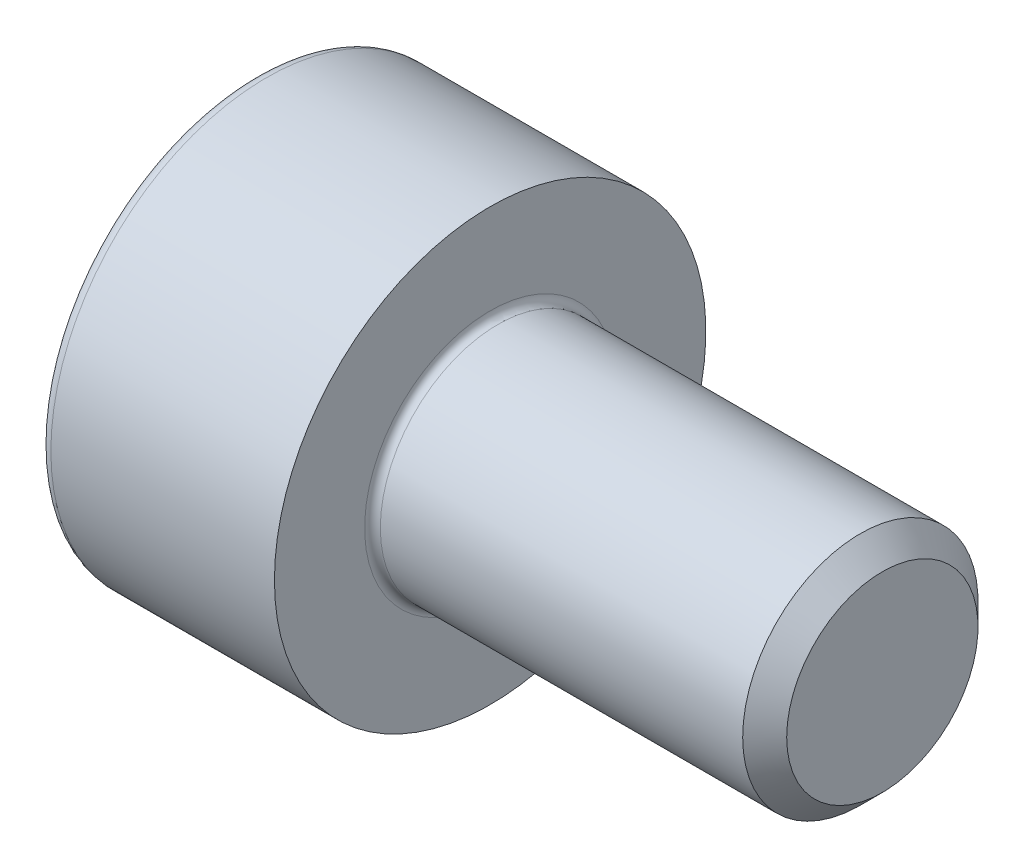
ISO-10303-21;
HEADER;
FILE_DESCRIPTION(('STEP AP214'),'2;1');
FILE_NAME('part.step','',(''),(''),'','','');
FILE_SCHEMA(('AUTOMOTIVE_DESIGN { 1 0 10303 214 1 1 1 1 }'));
ENDSEC;
DATA;
#1=APPLICATION_CONTEXT('core data for automotive mechanical design processes');
#2=APPLICATION_PROTOCOL_DEFINITION('international standard','automotive_design',2000,#1);
#3=PRODUCT_CONTEXT('',#1,'mechanical');
#4=PRODUCT('Part','Part','',(#3));
#5=PRODUCT_RELATED_PRODUCT_CATEGORY('part','',(#4));
#6=PRODUCT_DEFINITION_FORMATION('','',#4);
#7=PRODUCT_DEFINITION_CONTEXT('part definition',#1,'design');
#8=PRODUCT_DEFINITION('design','',#6,#7);
#9=PRODUCT_DEFINITION_SHAPE('','',#8);
#10=(LENGTH_UNIT() NAMED_UNIT(*) SI_UNIT(.MILLI.,.METRE.));
#11=(NAMED_UNIT(*) PLANE_ANGLE_UNIT() SI_UNIT($,.RADIAN.));
#12=(NAMED_UNIT(*) SI_UNIT($,.STERADIAN.) SOLID_ANGLE_UNIT());
#13=UNCERTAINTY_MEASURE_WITH_UNIT(LENGTH_MEASURE(1.E-05),#10,'distance_accuracy_value','');
#14=(GEOMETRIC_REPRESENTATION_CONTEXT(3) GLOBAL_UNCERTAINTY_ASSIGNED_CONTEXT((#13)) GLOBAL_UNIT_ASSIGNED_CONTEXT((#10,
#11,#12)) REPRESENTATION_CONTEXT('',''));
#15=CARTESIAN_POINT('',(0.,0.,0.));
#16=DIRECTION('',(0.,0.,1.));
#17=DIRECTION('',(1.,0.,0.));
#18=AXIS2_PLACEMENT_3D('',#15,#16,#17);
#19=CARTESIAN_POINT('',(0.,0.,0.));
#20=DIRECTION('',(-1.,0.,0.));
#21=DIRECTION('',(0.,0.,1.));
#22=AXIS2_PLACEMENT_3D('',#19,#20,#21);
#23=PLANE('',#22);
#24=DIRECTION('',(0.,-0.499999999999999,0.866025403784439));
#25=VECTOR('',#24,1.);
#26=CARTESIAN_POINT('',(0.,1.47801668912544,0.));
#27=LINE('',#26,#25);
#28=CARTESIAN_POINT('',(0.,1.47801668912544,0.));
#29=VERTEX_POINT('',#28);
#30=CARTESIAN_POINT('',(0.,0.739008344562723,1.28));
#31=VERTEX_POINT('',#30);
#32=EDGE_CURVE('E265',#29,#31,#27,.T.);
#33=ORIENTED_EDGE('',*,*,#32,.T.);
#34=DIRECTION('',(0.,1.,0.));
#35=VECTOR('',#34,1.);
#36=CARTESIAN_POINT('',(0.,-0.73900834456272,1.28));
#37=LINE('',#36,#35);
#38=CARTESIAN_POINT('',(0.,-0.73900834456272,1.28));
#39=VERTEX_POINT('',#38);
#40=EDGE_CURVE('E137',#39,#31,#37,.T.);
#41=ORIENTED_EDGE('',*,*,#40,.F.);
#42=DIRECTION('',(0.,-0.500000000000001,-0.866025403784438));
#43=VECTOR('',#42,1.);
#44=CARTESIAN_POINT('',(0.,-0.73900834456272,1.28));
#45=LINE('',#44,#43);
#46=CARTESIAN_POINT('',(0.,-1.47801668912544,0.));
#47=VERTEX_POINT('',#46);
#48=EDGE_CURVE('E268',#39,#47,#45,.T.);
#49=ORIENTED_EDGE('',*,*,#48,.T.);
#50=DIRECTION('',(0.,0.499999999999999,-0.866025403784439));
#51=VECTOR('',#50,1.);
#52=CARTESIAN_POINT('',(0.,-1.47801668912544,0.));
#53=LINE('',#52,#51);
#54=CARTESIAN_POINT('',(0.,-0.739008344562723,-1.28));
#55=VERTEX_POINT('',#54);
#56=EDGE_CURVE('E271',#47,#55,#53,.T.);
#57=ORIENTED_EDGE('',*,*,#56,.T.);
#58=DIRECTION('',(0.,-1.,0.));
#59=VECTOR('',#58,1.);
#60=CARTESIAN_POINT('',(0.,0.73900834456272,-1.28));
#61=LINE('',#60,#59);
#62=CARTESIAN_POINT('',(0.,0.73900834456272,-1.28));
#63=VERTEX_POINT('',#62);
#64=EDGE_CURVE('E274',#63,#55,#61,.T.);
#65=ORIENTED_EDGE('',*,*,#64,.F.);
#66=DIRECTION('',(0.,-0.500000000000001,-0.866025403784438));
#67=VECTOR('',#66,1.);
#68=CARTESIAN_POINT('',(0.,1.47801668912544,0.));
#69=LINE('',#68,#67);
#70=EDGE_CURVE('E132',#29,#63,#69,.T.);
#71=ORIENTED_EDGE('',*,*,#70,.F.);
#72=EDGE_LOOP('',(#33,#41,#49,#57,#65,#71));
#73=FACE_BOUND('',#72,.T.);
#74=CARTESIAN_POINT('',(0.,0.,0.));
#75=DIRECTION('',(-1.,0.,0.));
#76=DIRECTION('',(0.,0.,1.));
#77=AXIS2_PLACEMENT_3D('',#74,#75,#76);
#78=CIRCLE('',#77,2.6);
#79=CARTESIAN_POINT('',(0.,0.,2.6));
#80=VERTEX_POINT('',#79);
#81=EDGE_CURVE('E49',#80,#80,#78,.T.);
#82=ORIENTED_EDGE('',*,*,#81,.T.);
#83=EDGE_LOOP('',(#82));
#84=FACE_BOUND('',#83,.T.);
#85=ADVANCED_FACE('F41',(#73,#84),#23,.T.);
#86=CARTESIAN_POINT('',(-31.75,0.,0.));
#87=DIRECTION('',(-1.,0.,0.));
#88=DIRECTION('',(0.,0.,1.));
#89=AXIS2_PLACEMENT_3D('',#86,#87,#88);
#90=CYLINDRICAL_SURFACE('',#89,2.75);
#91=CARTESIAN_POINT('',(0.149999999999997,0.,0.));
#92=DIRECTION('',(-1.,0.,0.));
#93=DIRECTION('',(0.,0.,1.));
#94=AXIS2_PLACEMENT_3D('',#91,#92,#93);
#95=CIRCLE('',#94,2.75);
#96=CARTESIAN_POINT('',(0.149999999999997,0.,2.75));
#97=VERTEX_POINT('',#96);
#98=EDGE_CURVE('E11',#97,#97,#95,.F.);
#99=ORIENTED_EDGE('',*,*,#98,.T.);
#100=EDGE_LOOP('',(#99));
#101=FACE_BOUND('',#100,.T.);
#102=CARTESIAN_POINT('',(3.,0.,0.));
#103=DIRECTION('',(-1.,0.,0.));
#104=DIRECTION('',(0.,0.,1.));
#105=AXIS2_PLACEMENT_3D('',#102,#103,#104);
#106=CIRCLE('',#105,2.75);
#107=CARTESIAN_POINT('',(3.,0.,2.75));
#108=VERTEX_POINT('',#107);
#109=EDGE_CURVE('E155',#108,#108,#106,.T.);
#110=ORIENTED_EDGE('',*,*,#109,.T.);
#111=EDGE_LOOP('',(#110));
#112=FACE_BOUND('',#111,.T.);
#113=ADVANCED_FACE('F180',(#101,#112),#90,.T.);
#114=CARTESIAN_POINT('',(3.,2.75,0.));
#115=DIRECTION('',(1.,0.,0.));
#116=DIRECTION('',(0.,0.,-1.));
#117=AXIS2_PLACEMENT_3D('',#114,#115,#116);
#118=PLANE('',#117);
#119=CARTESIAN_POINT('',(3.,0.,0.));
#120=DIRECTION('',(1.,0.,0.));
#121=DIRECTION('',(0.,0.,-1.));
#122=AXIS2_PLACEMENT_3D('',#119,#120,#121);
#123=CIRCLE('',#122,1.6);
#124=CARTESIAN_POINT('',(3.,0.,-1.6));
#125=VERTEX_POINT('',#124);
#126=EDGE_CURVE('E158',#125,#125,#123,.F.);
#127=ORIENTED_EDGE('',*,*,#126,.T.);
#128=EDGE_LOOP('',(#127));
#129=FACE_BOUND('',#128,.T.);
#130=ORIENTED_EDGE('',*,*,#109,.F.);
#131=EDGE_LOOP('',(#130));
#132=FACE_BOUND('',#131,.T.);
#133=ADVANCED_FACE('F185',(#129,#132),#118,.T.);
#134=CARTESIAN_POINT('',(-31.75,0.,0.));
#135=DIRECTION('',(-1.,0.,0.));
#136=DIRECTION('',(0.,0.,1.));
#137=AXIS2_PLACEMENT_3D('',#134,#135,#136);
#138=CYLINDRICAL_SURFACE('',#137,1.5);
#139=CARTESIAN_POINT('',(3.1,0.,0.));
#140=DIRECTION('',(1.,0.,0.));
#141=DIRECTION('',(0.,0.,-1.));
#142=AXIS2_PLACEMENT_3D('',#139,#140,#141);
#143=CIRCLE('',#142,1.5);
#144=CARTESIAN_POINT('',(3.1,0.,-1.5));
#145=VERTEX_POINT('',#144);
#146=EDGE_CURVE('E161',#145,#145,#143,.T.);
#147=ORIENTED_EDGE('',*,*,#146,.T.);
#148=EDGE_LOOP('',(#147));
#149=FACE_BOUND('',#148,.T.);
#150=CARTESIAN_POINT('',(7.71950000000001,0.,0.));
#151=DIRECTION('',(-1.,0.,0.));
#152=DIRECTION('',(0.,0.,1.));
#153=AXIS2_PLACEMENT_3D('',#150,#151,#152);
#154=CIRCLE('',#153,1.5);
#155=CARTESIAN_POINT('',(7.71950000000001,0.,1.5));
#156=VERTEX_POINT('',#155);
#157=EDGE_CURVE('E152',#156,#156,#154,.T.);
#158=ORIENTED_EDGE('',*,*,#157,.T.);
#159=EDGE_LOOP('',(#158));
#160=FACE_BOUND('',#159,.T.);
#161=ADVANCED_FACE('F191',(#149,#160),#138,.T.);
#162=CARTESIAN_POINT('',(8.,0.,0.));
#163=DIRECTION('',(-1.,0.,0.));
#164=DIRECTION('',(0.,0.,1.));
#165=AXIS2_PLACEMENT_3D('',#162,#163,#164);
#166=CONICAL_SURFACE('',#165,1.2195,0.785398163397469);
#167=ORIENTED_EDGE('',*,*,#157,.F.);
#168=EDGE_LOOP('',(#167));
#169=FACE_BOUND('',#168,.T.);
#170=CARTESIAN_POINT('',(8.,0.,0.));
#171=DIRECTION('',(-1.,0.,0.));
#172=DIRECTION('',(0.,0.,1.));
#173=AXIS2_PLACEMENT_3D('',#170,#171,#172);
#174=CIRCLE('',#173,1.2195);
#175=CARTESIAN_POINT('',(8.,0.,1.2195));
#176=VERTEX_POINT('',#175);
#177=EDGE_CURVE('E148',#176,#176,#174,.T.);
#178=ORIENTED_EDGE('',*,*,#177,.T.);
#179=EDGE_LOOP('',(#178));
#180=FACE_BOUND('',#179,.T.);
#181=ADVANCED_FACE('F195',(#169,#180),#166,.T.);
#182=CARTESIAN_POINT('',(8.,1.2195,0.));
#183=DIRECTION('',(1.,0.,0.));
#184=DIRECTION('',(0.,0.,-1.));
#185=AXIS2_PLACEMENT_3D('',#182,#183,#184);
#186=PLANE('',#185);
#187=ORIENTED_EDGE('',*,*,#177,.F.);
#188=EDGE_LOOP('',(#187));
#189=FACE_BOUND('',#188,.T.);
#190=ADVANCED_FACE('F177',(#189),#186,.T.);
#191=CARTESIAN_POINT('',(3.1,0.,0.));
#192=DIRECTION('',(1.,0.,0.));
#193=DIRECTION('',(0.,0.,-1.));
#194=AXIS2_PLACEMENT_3D('',#191,#192,#193);
#195=TOROIDAL_SURFACE('',#194,1.6,0.1);
#196=ORIENTED_EDGE('',*,*,#146,.F.);
#197=EDGE_LOOP('',(#196));
#198=FACE_BOUND('',#197,.T.);
#199=ORIENTED_EDGE('',*,*,#126,.F.);
#200=EDGE_LOOP('',(#199));
#201=FACE_BOUND('',#200,.T.);
#202=ADVANCED_FACE('F168',(#198,#201),#195,.F.);
#203=CARTESIAN_POINT('',(0.149999999999997,0.,0.));
#204=DIRECTION('',(-1.,0.,0.));
#205=DIRECTION('',(0.,0.,1.));
#206=AXIS2_PLACEMENT_3D('',#203,#204,#205);
#207=TOROIDAL_SURFACE('',#206,2.6,0.15);
#208=ORIENTED_EDGE('',*,*,#98,.F.);
#209=EDGE_LOOP('',(#208));
#210=FACE_BOUND('',#209,.T.);
#211=ORIENTED_EDGE('',*,*,#81,.F.);
#212=EDGE_LOOP('',(#211));
#213=FACE_BOUND('',#212,.T.);
#214=ADVANCED_FACE('F43',(#210,#213),#207,.T.);
#215=CARTESIAN_POINT('',(1.3,1.47801668912544,0.));
#216=DIRECTION('',(0.,-0.866025403784439,-0.499999999999999));
#217=DIRECTION('',(0.,0.499999999999999,-0.866025403784439));
#218=AXIS2_PLACEMENT_3D('',#215,#216,#217);
#219=PLANE('',#218);
#220=ORIENTED_EDGE('',*,*,#32,.F.);
#221=DIRECTION('',(-1.,0.,0.));
#222=VECTOR('',#221,1.);
#223=CARTESIAN_POINT('',(1.3,1.47801668912544,0.));
#224=LINE('',#223,#222);
#225=CARTESIAN_POINT('',(1.3,1.47801668912544,0.));
#226=VERTEX_POINT('',#225);
#227=EDGE_CURVE('E255',#226,#29,#224,.T.);
#228=ORIENTED_EDGE('',*,*,#227,.F.);
#229=DIRECTION('',(0.,-0.499999999999999,0.866025403784439));
#230=VECTOR('',#229,1.);
#231=CARTESIAN_POINT('',(1.3,1.47801668912544,0.));
#232=LINE('',#231,#230);
#233=CARTESIAN_POINT('',(1.3,1.10851251684408,0.64));
#234=VERTEX_POINT('',#233);
#235=EDGE_CURVE('E124',#226,#234,#232,.T.);
#236=ORIENTED_EDGE('',*,*,#235,.T.);
#237=CARTESIAN_POINT('',(1.3,0.739008344562723,1.28));
#238=VERTEX_POINT('',#237);
#239=EDGE_CURVE('E115',#234,#238,#232,.T.);
#240=ORIENTED_EDGE('',*,*,#239,.T.);
#241=DIRECTION('',(-1.,0.,0.));
#242=VECTOR('',#241,1.);
#243=CARTESIAN_POINT('',(1.3,0.739008344562723,1.28));
#244=LINE('',#243,#242);
#245=EDGE_CURVE('E129',#238,#31,#244,.T.);
#246=ORIENTED_EDGE('',*,*,#245,.T.);
#247=EDGE_LOOP('',(#220,#228,#236,#240,#246));
#248=FACE_BOUND('',#247,.T.);
#249=ADVANCED_FACE('F128',(#248),#219,.T.);
#250=CARTESIAN_POINT('',(1.3,-0.73900834456272,1.28));
#251=DIRECTION('',(0.,0.,1.));
#252=DIRECTION('',(0.,-1.,0.));
#253=AXIS2_PLACEMENT_3D('',#250,#251,#252);
#254=PLANE('',#253);
#255=ORIENTED_EDGE('',*,*,#40,.T.);
#256=ORIENTED_EDGE('',*,*,#245,.F.);
#257=DIRECTION('',(0.,1.,0.));
#258=VECTOR('',#257,1.);
#259=CARTESIAN_POINT('',(1.3,-0.73900834456272,1.28));
#260=LINE('',#259,#258);
#261=CARTESIAN_POINT('',(1.3,0.,1.28));
#262=VERTEX_POINT('',#261);
#263=EDGE_CURVE('E112',#262,#238,#260,.T.);
#264=ORIENTED_EDGE('',*,*,#263,.F.);
#265=CARTESIAN_POINT('',(1.3,-0.73900834456272,1.28));
#266=VERTEX_POINT('',#265);
#267=EDGE_CURVE('E123',#266,#262,#260,.T.);
#268=ORIENTED_EDGE('',*,*,#267,.F.);
#269=DIRECTION('',(-1.,0.,0.));
#270=VECTOR('',#269,1.);
#271=CARTESIAN_POINT('',(1.3,-0.73900834456272,1.28));
#272=LINE('',#271,#270);
#273=EDGE_CURVE('E139',#266,#39,#272,.T.);
#274=ORIENTED_EDGE('',*,*,#273,.T.);
#275=EDGE_LOOP('',(#255,#256,#264,#268,#274));
#276=FACE_BOUND('',#275,.T.);
#277=ADVANCED_FACE('F134',(#276),#254,.F.);
#278=CARTESIAN_POINT('',(1.3,-0.73900834456272,1.28));
#279=DIRECTION('',(0.,0.866025403784438,-0.500000000000001));
#280=DIRECTION('',(0.,0.500000000000001,0.866025403784438));
#281=AXIS2_PLACEMENT_3D('',#278,#279,#280);
#282=PLANE('',#281);
#283=ORIENTED_EDGE('',*,*,#48,.F.);
#284=ORIENTED_EDGE('',*,*,#273,.F.);
#285=DIRECTION('',(0.,-0.500000000000001,-0.866025403784438));
#286=VECTOR('',#285,1.);
#287=CARTESIAN_POINT('',(1.3,-0.73900834456272,1.28));
#288=LINE('',#287,#286);
#289=CARTESIAN_POINT('',(1.3,-1.10851251684408,0.640000000000002));
#290=VERTEX_POINT('',#289);
#291=EDGE_CURVE('E294',#266,#290,#288,.T.);
#292=ORIENTED_EDGE('',*,*,#291,.T.);
#293=CARTESIAN_POINT('',(1.3,-1.47801668912544,0.));
#294=VERTEX_POINT('',#293);
#295=EDGE_CURVE('E283',#290,#294,#288,.T.);
#296=ORIENTED_EDGE('',*,*,#295,.T.);
#297=DIRECTION('',(-1.,0.,0.));
#298=VECTOR('',#297,1.);
#299=CARTESIAN_POINT('',(1.3,-1.47801668912544,0.));
#300=LINE('',#299,#298);
#301=EDGE_CURVE('E144',#294,#47,#300,.T.);
#302=ORIENTED_EDGE('',*,*,#301,.T.);
#303=EDGE_LOOP('',(#283,#284,#292,#296,#302));
#304=FACE_BOUND('',#303,.T.);
#305=ADVANCED_FACE('F209',(#304),#282,.T.);
#306=CARTESIAN_POINT('',(1.3,-1.47801668912544,0.));
#307=DIRECTION('',(0.,0.866025403784439,0.499999999999999));
#308=DIRECTION('',(0.,-0.499999999999999,0.866025403784439));
#309=AXIS2_PLACEMENT_3D('',#306,#307,#308);
#310=PLANE('',#309);
#311=ORIENTED_EDGE('',*,*,#56,.F.);
#312=ORIENTED_EDGE('',*,*,#301,.F.);
#313=DIRECTION('',(0.,0.499999999999999,-0.866025403784439));
#314=VECTOR('',#313,1.);
#315=CARTESIAN_POINT('',(1.3,-1.47801668912544,0.));
#316=LINE('',#315,#314);
#317=CARTESIAN_POINT('',(1.3,-1.10851251684408,-0.639999999999999));
#318=VERTEX_POINT('',#317);
#319=EDGE_CURVE('E261',#294,#318,#316,.T.);
#320=ORIENTED_EDGE('',*,*,#319,.T.);
#321=CARTESIAN_POINT('',(1.3,-0.739008344562723,-1.28));
#322=VERTEX_POINT('',#321);
#323=EDGE_CURVE('E293',#318,#322,#316,.T.);
#324=ORIENTED_EDGE('',*,*,#323,.T.);
#325=DIRECTION('',(-1.,0.,0.));
#326=VECTOR('',#325,1.);
#327=CARTESIAN_POINT('',(1.3,-0.739008344562723,-1.28));
#328=LINE('',#327,#326);
#329=EDGE_CURVE('E254',#322,#55,#328,.T.);
#330=ORIENTED_EDGE('',*,*,#329,.T.);
#331=EDGE_LOOP('',(#311,#312,#320,#324,#330));
#332=FACE_BOUND('',#331,.T.);
#333=ADVANCED_FACE('F212',(#332),#310,.T.);
#334=CARTESIAN_POINT('',(1.3,0.73900834456272,-1.28));
#335=DIRECTION('',(0.,0.,-1.));
#336=DIRECTION('',(0.,1.,0.));
#337=AXIS2_PLACEMENT_3D('',#334,#335,#336);
#338=PLANE('',#337);
#339=ORIENTED_EDGE('',*,*,#64,.T.);
#340=ORIENTED_EDGE('',*,*,#329,.F.);
#341=DIRECTION('',(0.,-1.,0.));
#342=VECTOR('',#341,1.);
#343=CARTESIAN_POINT('',(1.3,0.73900834456272,-1.28));
#344=LINE('',#343,#342);
#345=CARTESIAN_POINT('',(1.3,0.,-1.28));
#346=VERTEX_POINT('',#345);
#347=EDGE_CURVE('E258',#346,#322,#344,.T.);
#348=ORIENTED_EDGE('',*,*,#347,.F.);
#349=CARTESIAN_POINT('',(1.3,0.73900834456272,-1.28));
#350=VERTEX_POINT('',#349);
#351=EDGE_CURVE('E56',#350,#346,#344,.T.);
#352=ORIENTED_EDGE('',*,*,#351,.F.);
#353=DIRECTION('',(-1.,0.,0.));
#354=VECTOR('',#353,1.);
#355=CARTESIAN_POINT('',(1.3,0.73900834456272,-1.28));
#356=LINE('',#355,#354);
#357=EDGE_CURVE('E251',#350,#63,#356,.T.);
#358=ORIENTED_EDGE('',*,*,#357,.T.);
#359=EDGE_LOOP('',(#339,#340,#348,#352,#358));
#360=FACE_BOUND('',#359,.T.);
#361=ADVANCED_FACE('F216',(#360),#338,.F.);
#362=CARTESIAN_POINT('',(1.3,1.47801668912544,0.));
#363=DIRECTION('',(0.,0.866025403784438,-0.500000000000001));
#364=DIRECTION('',(0.,0.500000000000001,0.866025403784438));
#365=AXIS2_PLACEMENT_3D('',#362,#363,#364);
#366=PLANE('',#365);
#367=ORIENTED_EDGE('',*,*,#70,.T.);
#368=ORIENTED_EDGE('',*,*,#357,.F.);
#369=DIRECTION('',(0.,-0.500000000000001,-0.866025403784438));
#370=VECTOR('',#369,1.);
#371=CARTESIAN_POINT('',(1.3,1.47801668912544,0.));
#372=LINE('',#371,#370);
#373=CARTESIAN_POINT('',(1.3,1.10851251684408,-0.640000000000002));
#374=VERTEX_POINT('',#373);
#375=EDGE_CURVE('E241',#374,#350,#372,.T.);
#376=ORIENTED_EDGE('',*,*,#375,.F.);
#377=EDGE_CURVE('E247',#226,#374,#372,.T.);
#378=ORIENTED_EDGE('',*,*,#377,.F.);
#379=ORIENTED_EDGE('',*,*,#227,.T.);
#380=EDGE_LOOP('',(#367,#368,#376,#378,#379));
#381=FACE_BOUND('',#380,.T.);
#382=ADVANCED_FACE('F220',(#381),#366,.F.);
#383=CARTESIAN_POINT('',(1.3,1.47801668912544,0.));
#384=DIRECTION('',(1.,0.,0.));
#385=DIRECTION('',(0.,0.,-1.));
#386=AXIS2_PLACEMENT_3D('',#383,#384,#385);
#387=PLANE('',#386);
#388=ORIENTED_EDGE('',*,*,#347,.T.);
#389=ORIENTED_EDGE('',*,*,#323,.F.);
#390=CARTESIAN_POINT('',(1.3,0.,0.));
#391=DIRECTION('',(-1.,0.,0.));
#392=DIRECTION('',(0.,0.,1.));
#393=AXIS2_PLACEMENT_3D('',#390,#391,#392);
#394=CIRCLE('',#393,1.28);
#395=EDGE_CURVE('E289',#346,#318,#394,.T.);
#396=ORIENTED_EDGE('',*,*,#395,.F.);
#397=EDGE_LOOP('',(#388,#389,#396));
#398=FACE_BOUND('',#397,.T.);
#399=ADVANCED_FACE('F224',(#398),#387,.F.);
#400=ORIENTED_EDGE('',*,*,#319,.F.);
#401=ORIENTED_EDGE('',*,*,#295,.F.);
#402=EDGE_CURVE('E142',#318,#290,#394,.T.);
#403=ORIENTED_EDGE('',*,*,#402,.F.);
#404=EDGE_LOOP('',(#400,#401,#403));
#405=FACE_BOUND('',#404,.T.);
#406=ADVANCED_FACE('F227',(#405),#387,.F.);
#407=ORIENTED_EDGE('',*,*,#291,.F.);
#408=ORIENTED_EDGE('',*,*,#267,.T.);
#409=EDGE_CURVE('E138',#290,#262,#394,.T.);
#410=ORIENTED_EDGE('',*,*,#409,.F.);
#411=EDGE_LOOP('',(#407,#408,#410));
#412=FACE_BOUND('',#411,.T.);
#413=ADVANCED_FACE('F232',(#412),#387,.F.);
#414=ORIENTED_EDGE('',*,*,#263,.T.);
#415=ORIENTED_EDGE('',*,*,#239,.F.);
#416=EDGE_CURVE('E118',#262,#234,#394,.T.);
#417=ORIENTED_EDGE('',*,*,#416,.F.);
#418=EDGE_LOOP('',(#414,#415,#417));
#419=FACE_BOUND('',#418,.T.);
#420=ADVANCED_FACE('F114',(#419),#387,.F.);
#421=ORIENTED_EDGE('',*,*,#235,.F.);
#422=ORIENTED_EDGE('',*,*,#377,.T.);
#423=EDGE_CURVE('E149',#234,#374,#394,.T.);
#424=ORIENTED_EDGE('',*,*,#423,.F.);
#425=EDGE_LOOP('',(#421,#422,#424));
#426=FACE_BOUND('',#425,.T.);
#427=ADVANCED_FACE('F235',(#426),#387,.F.);
#428=ORIENTED_EDGE('',*,*,#375,.T.);
#429=ORIENTED_EDGE('',*,*,#351,.T.);
#430=EDGE_CURVE('E244',#374,#346,#394,.T.);
#431=ORIENTED_EDGE('',*,*,#430,.F.);
#432=EDGE_LOOP('',(#428,#429,#431));
#433=FACE_BOUND('',#432,.T.);
#434=ADVANCED_FACE('F205',(#433),#387,.F.);
#435=CARTESIAN_POINT('',(1.3,0.,0.));
#436=DIRECTION('',(-1.,0.,0.));
#437=DIRECTION('',(0.,0.,1.));
#438=AXIS2_PLACEMENT_3D('',#435,#436,#437);
#439=CONICAL_SURFACE('',#438,1.28,1.04719755119659);
#440=CARTESIAN_POINT('',(2.03900834456273,0.,0.));
#441=VERTEX_POINT('',#440);
#442=VERTEX_LOOP('',#441);
#443=FACE_BOUND('',#442,.T.);
#444=ORIENTED_EDGE('',*,*,#416,.T.);
#445=ORIENTED_EDGE('',*,*,#423,.T.);
#446=ORIENTED_EDGE('',*,*,#430,.T.);
#447=ORIENTED_EDGE('',*,*,#395,.T.);
#448=ORIENTED_EDGE('',*,*,#402,.T.);
#449=ORIENTED_EDGE('',*,*,#409,.T.);
#450=EDGE_LOOP('',(#444,#445,#446,#447,#448,#449));
#451=FACE_BOUND('',#450,.T.);
#452=ADVANCED_FACE('F203',(#443,#451),#439,.F.);
#453=CLOSED_SHELL('',(#85,#113,#133,#161,#181,#190,#202,#214,#249,#277,#305,#333,#361,#382,#399,
#406,#413,#420,#427,#434,#452));
#454=MANIFOLD_SOLID_BREP('B2',#453);
#455=ADVANCED_BREP_SHAPE_REPRESENTATION('',(#18,#454),#14);
#456=SHAPE_DEFINITION_REPRESENTATION(#9,#455);
ENDSEC;
END-ISO-10303-21;
